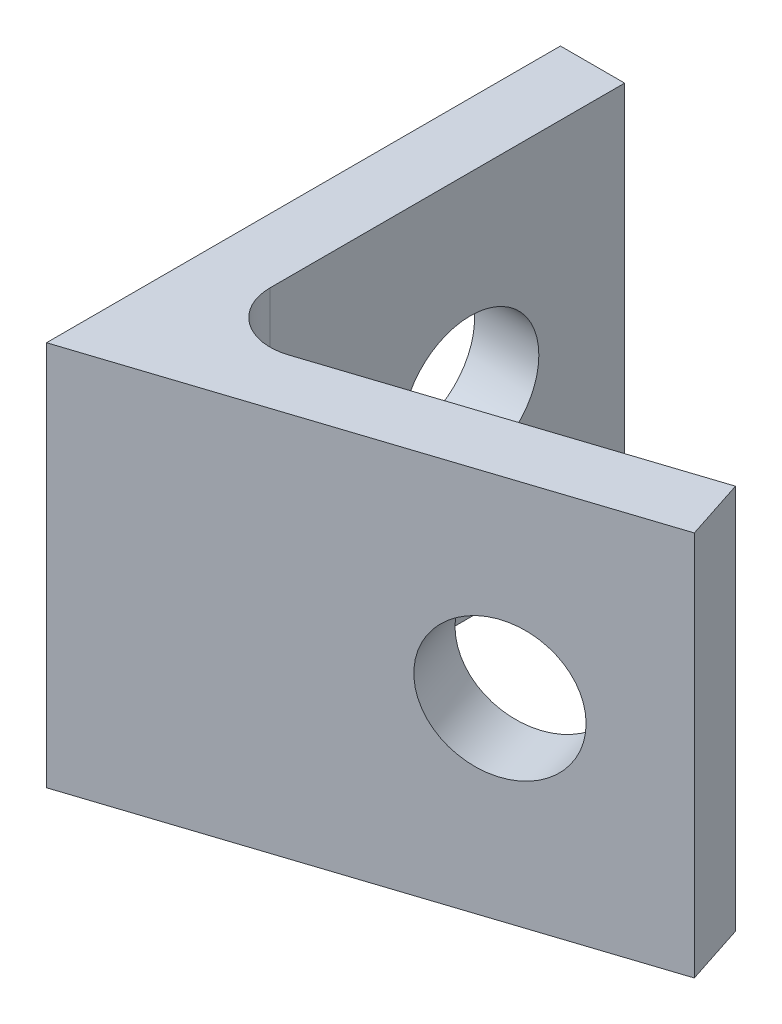
ISO-10303-21;
HEADER;
FILE_DESCRIPTION(('STEP AP214'),'2;1');
FILE_NAME('part.step','',(''),(''),'','','');
FILE_SCHEMA(('AUTOMOTIVE_DESIGN { 1 0 10303 214 1 1 1 1 }'));
ENDSEC;
DATA;
#1=APPLICATION_CONTEXT('core data for automotive mechanical design processes');
#2=APPLICATION_PROTOCOL_DEFINITION('international standard','automotive_design',2000,#1);
#3=PRODUCT_CONTEXT('',#1,'mechanical');
#4=PRODUCT('Part','Part','',(#3));
#5=PRODUCT_RELATED_PRODUCT_CATEGORY('part','',(#4));
#6=PRODUCT_DEFINITION_FORMATION('','',#4);
#7=PRODUCT_DEFINITION_CONTEXT('part definition',#1,'design');
#8=PRODUCT_DEFINITION('design','',#6,#7);
#9=PRODUCT_DEFINITION_SHAPE('','',#8);
#10=(LENGTH_UNIT() NAMED_UNIT(*) SI_UNIT(.MILLI.,.METRE.));
#11=(NAMED_UNIT(*) PLANE_ANGLE_UNIT() SI_UNIT($,.RADIAN.));
#12=(NAMED_UNIT(*) SI_UNIT($,.STERADIAN.) SOLID_ANGLE_UNIT());
#13=UNCERTAINTY_MEASURE_WITH_UNIT(LENGTH_MEASURE(1.E-05),#10,'distance_accuracy_value','');
#14=(GEOMETRIC_REPRESENTATION_CONTEXT(3) GLOBAL_UNCERTAINTY_ASSIGNED_CONTEXT((#13)) GLOBAL_UNIT_ASSIGNED_CONTEXT((#10,
#11,#12)) REPRESENTATION_CONTEXT('',''));
#15=CARTESIAN_POINT('',(0.,0.,0.));
#16=DIRECTION('',(0.,0.,1.));
#17=DIRECTION('',(1.,0.,0.));
#18=AXIS2_PLACEMENT_3D('',#15,#16,#17);
#19=CARTESIAN_POINT('',(3.175,19.05,-25.4));
#20=DIRECTION('',(1.,0.,0.));
#21=DIRECTION('',(0.,0.,-1.));
#22=AXIS2_PLACEMENT_3D('',#19,#20,#21);
#23=PLANE('',#22);
#24=CARTESIAN_POINT('',(3.175,9.525,-17.78));
#25=DIRECTION('',(1.,0.,0.));
#26=DIRECTION('',(0.,0.,-1.));
#27=AXIS2_PLACEMENT_3D('',#24,#25,#26);
#28=CIRCLE('',#27,3.3782);
#29=CARTESIAN_POINT('',(3.175,9.525,-21.1582));
#30=VERTEX_POINT('',#29);
#31=EDGE_CURVE('E131',#30,#30,#28,.T.);
#32=ORIENTED_EDGE('',*,*,#31,.F.);
#33=EDGE_LOOP('',(#32));
#34=FACE_BOUND('',#33,.T.);
#35=DIRECTION('',(0.,0.,1.));
#36=VECTOR('',#35,1.);
#37=CARTESIAN_POINT('',(3.175,19.05,-25.4));
#38=LINE('',#37,#36);
#39=CARTESIAN_POINT('',(3.175,19.05,-25.4));
#40=VERTEX_POINT('',#39);
#41=CARTESIAN_POINT('',(3.175,19.05,-7.87201998770114));
#42=VERTEX_POINT('',#41);
#43=EDGE_CURVE('E103',#40,#42,#38,.T.);
#44=ORIENTED_EDGE('',*,*,#43,.T.);
#45=DIRECTION('',(0.,-1.,0.));
#46=VECTOR('',#45,1.);
#47=CARTESIAN_POINT('',(3.175,0.,-7.87201998770114));
#48=LINE('',#47,#46);
#49=CARTESIAN_POINT('',(3.175,0.,-7.87201998770114));
#50=VERTEX_POINT('',#49);
#51=EDGE_CURVE('E145',#42,#50,#48,.T.);
#52=ORIENTED_EDGE('',*,*,#51,.T.);
#53=DIRECTION('',(0.,0.,1.));
#54=VECTOR('',#53,1.);
#55=CARTESIAN_POINT('',(3.175,0.,-25.4));
#56=LINE('',#55,#54);
#57=CARTESIAN_POINT('',(3.175,0.,-25.4));
#58=VERTEX_POINT('',#57);
#59=EDGE_CURVE('E128',#58,#50,#56,.T.);
#60=ORIENTED_EDGE('',*,*,#59,.F.);
#61=DIRECTION('',(0.,-1.,0.));
#62=VECTOR('',#61,1.);
#63=CARTESIAN_POINT('',(3.175,19.05,-25.4));
#64=LINE('',#63,#62);
#65=EDGE_CURVE('E143',#40,#58,#64,.T.);
#66=ORIENTED_EDGE('',*,*,#65,.F.);
#67=EDGE_LOOP('',(#44,#52,#60,#66));
#68=FACE_BOUND('',#67,.T.);
#69=ADVANCED_FACE('F39',(#34,#68),#23,.T.);
#70=CARTESIAN_POINT('',(0.,19.05,-25.4));
#71=DIRECTION('',(0.,0.,-1.));
#72=DIRECTION('',(-1.,0.,0.));
#73=AXIS2_PLACEMENT_3D('',#70,#71,#72);
#74=PLANE('',#73);
#75=DIRECTION('',(1.,0.,0.));
#76=VECTOR('',#75,1.);
#77=CARTESIAN_POINT('',(0.,0.,-25.4));
#78=LINE('',#77,#76);
#79=CARTESIAN_POINT('',(0.,0.,-25.4));
#80=VERTEX_POINT('',#79);
#81=EDGE_CURVE('E140',#80,#58,#78,.T.);
#82=ORIENTED_EDGE('',*,*,#81,.F.);
#83=DIRECTION('',(0.,-1.,0.));
#84=VECTOR('',#83,1.);
#85=CARTESIAN_POINT('',(0.,19.05,-25.4));
#86=LINE('',#85,#84);
#87=CARTESIAN_POINT('',(0.,19.05,-25.4));
#88=VERTEX_POINT('',#87);
#89=EDGE_CURVE('E146',#88,#80,#86,.T.);
#90=ORIENTED_EDGE('',*,*,#89,.F.);
#91=DIRECTION('',(1.,0.,0.));
#92=VECTOR('',#91,1.);
#93=CARTESIAN_POINT('',(0.,19.05,-25.4));
#94=LINE('',#93,#92);
#95=EDGE_CURVE('E111',#88,#40,#94,.T.);
#96=ORIENTED_EDGE('',*,*,#95,.T.);
#97=ORIENTED_EDGE('',*,*,#65,.T.);
#98=EDGE_LOOP('',(#82,#90,#96,#97));
#99=FACE_BOUND('',#98,.T.);
#100=ADVANCED_FACE('F162',(#99),#74,.T.);
#101=CARTESIAN_POINT('',(0.,19.05,0.));
#102=DIRECTION('',(-1.,0.,0.));
#103=DIRECTION('',(0.,0.,1.));
#104=AXIS2_PLACEMENT_3D('',#101,#102,#103);
#105=PLANE('',#104);
#106=CARTESIAN_POINT('',(0.,9.525,-17.78));
#107=DIRECTION('',(-1.,0.,0.));
#108=DIRECTION('',(0.,0.,1.));
#109=AXIS2_PLACEMENT_3D('',#106,#107,#108);
#110=CIRCLE('',#109,3.3782);
#111=CARTESIAN_POINT('',(0.,9.525,-14.4018));
#112=VERTEX_POINT('',#111);
#113=EDGE_CURVE('E167',#112,#112,#110,.T.);
#114=ORIENTED_EDGE('',*,*,#113,.F.);
#115=EDGE_LOOP('',(#114));
#116=FACE_BOUND('',#115,.T.);
#117=DIRECTION('',(0.,0.,-1.));
#118=VECTOR('',#117,1.);
#119=CARTESIAN_POINT('',(0.,0.,0.));
#120=LINE('',#119,#118);
#121=CARTESIAN_POINT('',(0.,0.,0.));
#122=VERTEX_POINT('',#121);
#123=EDGE_CURVE('E137',#122,#80,#120,.T.);
#124=ORIENTED_EDGE('',*,*,#123,.F.);
#125=DIRECTION('',(0.,-1.,0.));
#126=VECTOR('',#125,1.);
#127=CARTESIAN_POINT('',(0.,19.05,0.));
#128=LINE('',#127,#126);
#129=CARTESIAN_POINT('',(0.,19.05,0.));
#130=VERTEX_POINT('',#129);
#131=EDGE_CURVE('E148',#130,#122,#128,.T.);
#132=ORIENTED_EDGE('',*,*,#131,.F.);
#133=DIRECTION('',(0.,0.,-1.));
#134=VECTOR('',#133,1.);
#135=CARTESIAN_POINT('',(0.,19.05,0.));
#136=LINE('',#135,#134);
#137=EDGE_CURVE('E120',#130,#88,#136,.T.);
#138=ORIENTED_EDGE('',*,*,#137,.T.);
#139=ORIENTED_EDGE('',*,*,#89,.T.);
#140=EDGE_LOOP('',(#124,#132,#138,#139));
#141=FACE_BOUND('',#140,.T.);
#142=ADVANCED_FACE('F183',(#116,#141),#105,.T.);
#143=CARTESIAN_POINT('',(24.1511405465603,19.05,-7.86653737678082));
#144=DIRECTION('',(0.309706195936253,0.,0.95083230498269));
#145=DIRECTION('',(0.95083230498269,0.,-0.309706195936253));
#146=AXIS2_PLACEMENT_3D('',#143,#144,#145);
#147=PLANE('',#146);
#148=CARTESIAN_POINT('',(16.9057983825922,9.525,-5.50657616374657));
#149=DIRECTION('',(0.309706195936253,0.,0.95083230498269));
#150=DIRECTION('',(0.95083230498269,0.,-0.309706195936253));
#151=AXIS2_PLACEMENT_3D('',#148,#149,#150);
#152=CIRCLE('',#151,3.37819999999999);
#153=CARTESIAN_POINT('',(20.1179000752847,9.525,-6.55282563485841));
#154=VERTEX_POINT('',#153);
#155=EDGE_CURVE('E173',#154,#154,#152,.T.);
#156=ORIENTED_EDGE('',*,*,#155,.F.);
#157=EDGE_LOOP('',(#156));
#158=FACE_BOUND('',#157,.T.);
#159=DIRECTION('',(-0.95083230498269,0.,0.309706195936253));
#160=VECTOR('',#159,1.);
#161=CARTESIAN_POINT('',(24.1511405465603,0.,-7.86653737678082));
#162=LINE('',#161,#160);
#163=CARTESIAN_POINT('',(24.1511405465603,0.,-7.86653737678082));
#164=VERTEX_POINT('',#163);
#165=EDGE_CURVE('E134',#164,#122,#162,.T.);
#166=ORIENTED_EDGE('',*,*,#165,.F.);
#167=DIRECTION('',(0.,-1.,0.));
#168=VECTOR('',#167,1.);
#169=CARTESIAN_POINT('',(24.1511405465603,19.05,-7.86653737678082));
#170=LINE('',#169,#168);
#171=CARTESIAN_POINT('',(24.1511405465603,19.05,-7.86653737678082));
#172=VERTEX_POINT('',#171);
#173=EDGE_CURVE('E110',#172,#164,#170,.T.);
#174=ORIENTED_EDGE('',*,*,#173,.F.);
#175=DIRECTION('',(-0.95083230498269,0.,0.309706195936253));
#176=VECTOR('',#175,1.);
#177=CARTESIAN_POINT('',(24.1511405465603,19.05,-7.86653737678082));
#178=LINE('',#177,#176);
#179=EDGE_CURVE('E118',#172,#130,#178,.T.);
#180=ORIENTED_EDGE('',*,*,#179,.T.);
#181=ORIENTED_EDGE('',*,*,#131,.T.);
#182=EDGE_LOOP('',(#166,#174,#180,#181));
#183=FACE_BOUND('',#182,.T.);
#184=ADVANCED_FACE('F180',(#158,#183),#147,.T.);
#185=CARTESIAN_POINT('',(23.1678233744627,19.05,-10.8854299451009));
#186=DIRECTION('',(0.95083230498269,0.,-0.309706195936253));
#187=DIRECTION('',(-0.309706195936253,0.,-0.95083230498269));
#188=AXIS2_PLACEMENT_3D('',#185,#186,#187);
#189=PLANE('',#188);
#190=DIRECTION('',(0.309706195936253,0.,0.95083230498269));
#191=VECTOR('',#190,1.);
#192=CARTESIAN_POINT('',(23.1678233744627,0.,-10.8854299451009));
#193=LINE('',#192,#191);
#194=CARTESIAN_POINT('',(23.1678233744627,0.,-10.8854299451009));
#195=VERTEX_POINT('',#194);
#196=EDGE_CURVE('E109',#195,#164,#193,.T.);
#197=ORIENTED_EDGE('',*,*,#196,.F.);
#198=DIRECTION('',(0.,-1.,0.));
#199=VECTOR('',#198,1.);
#200=CARTESIAN_POINT('',(23.1678233744627,19.05,-10.8854299451009));
#201=LINE('',#200,#199);
#202=CARTESIAN_POINT('',(23.1678233744627,19.05,-10.8854299451009));
#203=VERTEX_POINT('',#202);
#204=EDGE_CURVE('E97',#203,#195,#201,.T.);
#205=ORIENTED_EDGE('',*,*,#204,.F.);
#206=DIRECTION('',(0.309706195936253,0.,0.95083230498269));
#207=VECTOR('',#206,1.);
#208=CARTESIAN_POINT('',(23.1678233744627,19.05,-10.8854299451009));
#209=LINE('',#208,#207);
#210=EDGE_CURVE('E102',#203,#172,#209,.T.);
#211=ORIENTED_EDGE('',*,*,#210,.T.);
#212=ORIENTED_EDGE('',*,*,#173,.T.);
#213=EDGE_LOOP('',(#197,#205,#211,#212));
#214=FACE_BOUND('',#213,.T.);
#215=ADVANCED_FACE('F107',(#214),#189,.T.);
#216=CARTESIAN_POINT('',(3.175,19.05,-4.37334443761175));
#217=DIRECTION('',(-0.309706195936253,0.,-0.95083230498269));
#218=DIRECTION('',(-0.95083230498269,0.,0.309706195936253));
#219=AXIS2_PLACEMENT_3D('',#216,#217,#218);
#220=PLANE('',#219);
#221=CARTESIAN_POINT('',(15.9224812104946,9.525,-8.52546873206661));
#222=DIRECTION('',(-0.309706195936253,0.,-0.95083230498269));
#223=DIRECTION('',(-0.95083230498269,0.,0.309706195936253));
#224=AXIS2_PLACEMENT_3D('',#221,#222,#223);
#225=CIRCLE('',#224,3.37819999999999);
#226=CARTESIAN_POINT('',(12.7103795178021,9.525,-7.47921926095477));
#227=VERTEX_POINT('',#226);
#228=EDGE_CURVE('E170',#227,#227,#225,.T.);
#229=ORIENTED_EDGE('',*,*,#228,.F.);
#230=EDGE_LOOP('',(#229));
#231=FACE_BOUND('',#230,.T.);
#232=DIRECTION('',(0.95083230498269,0.,-0.309706195936253));
#233=VECTOR('',#232,1.);
#234=CARTESIAN_POINT('',(3.175,0.,-4.37334443761175));
#235=LINE('',#234,#233);
#236=CARTESIAN_POINT('',(6.50165373767808,0.,-5.45690593304511));
#237=VERTEX_POINT('',#236);
#238=EDGE_CURVE('E130',#237,#195,#235,.T.);
#239=ORIENTED_EDGE('',*,*,#238,.F.);
#240=DIRECTION('',(0.,-1.,0.));
#241=VECTOR('',#240,1.);
#242=CARTESIAN_POINT('',(6.50165373767808,19.05,-5.45690593304511));
#243=LINE('',#242,#241);
#244=CARTESIAN_POINT('',(6.50165373767808,19.05,-5.45690593304511));
#245=VERTEX_POINT('',#244);
#246=EDGE_CURVE('E54',#237,#245,#243,.F.);
#247=ORIENTED_EDGE('',*,*,#246,.T.);
#248=DIRECTION('',(0.95083230498269,0.,-0.309706195936253));
#249=VECTOR('',#248,1.);
#250=CARTESIAN_POINT('',(3.175,19.05,-4.37334443761175));
#251=LINE('',#250,#249);
#252=EDGE_CURVE('E94',#245,#203,#251,.T.);
#253=ORIENTED_EDGE('',*,*,#252,.T.);
#254=ORIENTED_EDGE('',*,*,#204,.T.);
#255=EDGE_LOOP('',(#239,#247,#253,#254));
#256=FACE_BOUND('',#255,.T.);
#257=ADVANCED_FACE('F96',(#231,#256),#220,.T.);
#258=CARTESIAN_POINT('',(0.,19.05,0.));
#259=DIRECTION('',(0.,1.,0.));
#260=DIRECTION('',(0.,0.,1.));
#261=AXIS2_PLACEMENT_3D('',#258,#259,#260);
#262=PLANE('',#261);
#263=ORIENTED_EDGE('',*,*,#43,.F.);
#264=ORIENTED_EDGE('',*,*,#95,.F.);
#265=ORIENTED_EDGE('',*,*,#137,.F.);
#266=ORIENTED_EDGE('',*,*,#179,.F.);
#267=ORIENTED_EDGE('',*,*,#210,.F.);
#268=ORIENTED_EDGE('',*,*,#252,.F.);
#269=CARTESIAN_POINT('',(5.715,19.05,-7.87201998770114));
#270=DIRECTION('',(0.,1.,0.));
#271=DIRECTION('',(0.,0.,1.));
#272=AXIS2_PLACEMENT_3D('',#269,#270,#271);
#273=CIRCLE('',#272,2.54);
#274=EDGE_CURVE('E11',#245,#42,#273,.F.);
#275=ORIENTED_EDGE('',*,*,#274,.T.);
#276=EDGE_LOOP('',(#263,#264,#265,#266,#267,#268,#275));
#277=FACE_BOUND('',#276,.T.);
#278=ADVANCED_FACE('F115',(#277),#262,.T.);
#279=CARTESIAN_POINT('',(0.,0.,0.));
#280=DIRECTION('',(0.,1.,0.));
#281=DIRECTION('',(0.,0.,1.));
#282=AXIS2_PLACEMENT_3D('',#279,#280,#281);
#283=PLANE('',#282);
#284=ORIENTED_EDGE('',*,*,#59,.T.);
#285=CARTESIAN_POINT('',(5.715,0.,-7.87201998770114));
#286=DIRECTION('',(0.,1.,0.));
#287=DIRECTION('',(0.,0.,1.));
#288=AXIS2_PLACEMENT_3D('',#285,#286,#287);
#289=CIRCLE('',#288,2.54);
#290=EDGE_CURVE('E47',#50,#237,#289,.T.);
#291=ORIENTED_EDGE('',*,*,#290,.T.);
#292=ORIENTED_EDGE('',*,*,#238,.T.);
#293=ORIENTED_EDGE('',*,*,#196,.T.);
#294=ORIENTED_EDGE('',*,*,#165,.T.);
#295=ORIENTED_EDGE('',*,*,#123,.T.);
#296=ORIENTED_EDGE('',*,*,#81,.T.);
#297=EDGE_LOOP('',(#284,#291,#292,#293,#294,#295,#296));
#298=FACE_BOUND('',#297,.T.);
#299=ADVANCED_FACE('F158',(#298),#283,.F.);
#300=CARTESIAN_POINT('',(5.715,19.05,-7.87201998770114));
#301=DIRECTION('',(0.,1.,0.));
#302=DIRECTION('',(0.,0.,1.));
#303=AXIS2_PLACEMENT_3D('',#300,#301,#302);
#304=CYLINDRICAL_SURFACE('',#303,2.54);
#305=ORIENTED_EDGE('',*,*,#274,.F.);
#306=ORIENTED_EDGE('',*,*,#246,.F.);
#307=ORIENTED_EDGE('',*,*,#290,.F.);
#308=ORIENTED_EDGE('',*,*,#51,.F.);
#309=EDGE_LOOP('',(#305,#306,#307,#308));
#310=FACE_BOUND('',#309,.T.);
#311=ADVANCED_FACE('F41',(#310),#304,.F.);
#312=CARTESIAN_POINT('',(0.,9.525,-17.78));
#313=DIRECTION('',(-1.,0.,0.));
#314=DIRECTION('',(0.,0.,1.));
#315=AXIS2_PLACEMENT_3D('',#312,#313,#314);
#316=CYLINDRICAL_SURFACE('',#315,3.3782);
#317=ORIENTED_EDGE('',*,*,#113,.T.);
#318=EDGE_LOOP('',(#317));
#319=FACE_BOUND('',#318,.T.);
#320=ORIENTED_EDGE('',*,*,#31,.T.);
#321=EDGE_LOOP('',(#320));
#322=FACE_BOUND('',#321,.T.);
#323=ADVANCED_FACE('F187',(#319,#322),#316,.F.);
#324=CARTESIAN_POINT('',(16.9057983825922,9.525,-5.50657616374657));
#325=DIRECTION('',(0.309706195936253,0.,0.95083230498269));
#326=DIRECTION('',(0.95083230498269,0.,-0.309706195936253));
#327=AXIS2_PLACEMENT_3D('',#324,#325,#326);
#328=CYLINDRICAL_SURFACE('',#327,3.37819999999999);
#329=ORIENTED_EDGE('',*,*,#155,.T.);
#330=EDGE_LOOP('',(#329));
#331=FACE_BOUND('',#330,.T.);
#332=ORIENTED_EDGE('',*,*,#228,.T.);
#333=EDGE_LOOP('',(#332));
#334=FACE_BOUND('',#333,.T.);
#335=ADVANCED_FACE('F177',(#331,#334),#328,.F.);
#336=CLOSED_SHELL('',(#69,#100,#142,#184,#215,#257,#278,#299,#311,#323,#335));
#337=MANIFOLD_SOLID_BREP('B2',#336);
#338=ADVANCED_BREP_SHAPE_REPRESENTATION('',(#18,#337),#14);
#339=SHAPE_DEFINITION_REPRESENTATION(#9,#338);
ENDSEC;
END-ISO-10303-21;
